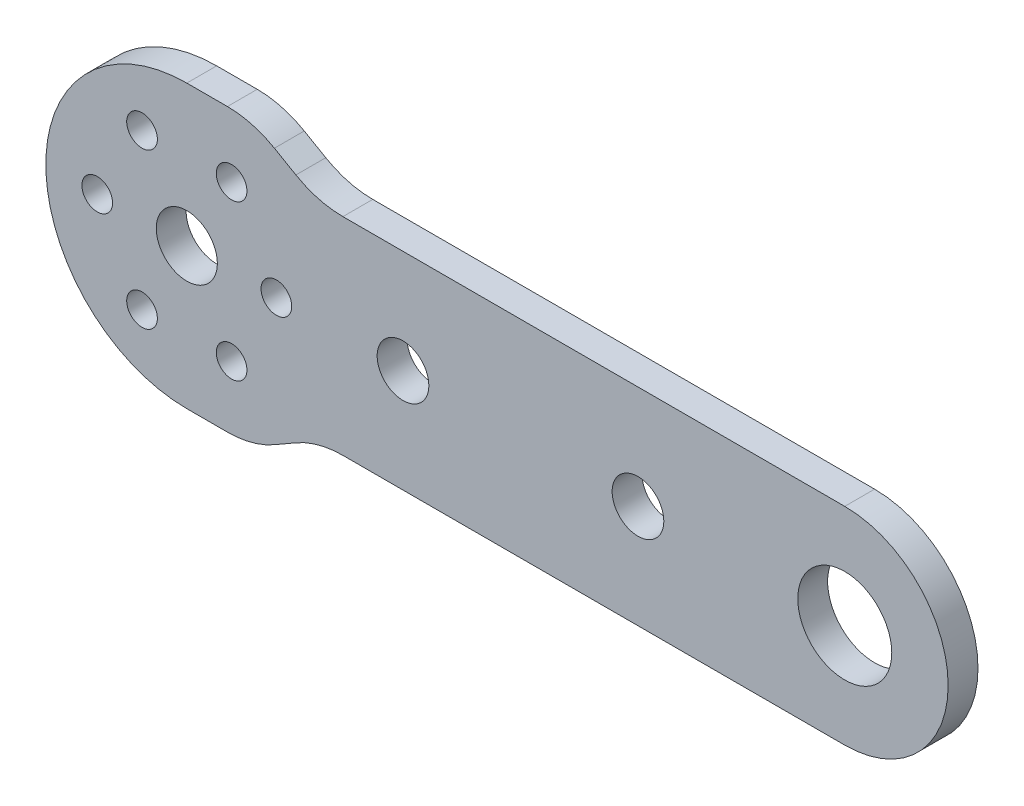
ISO-10303-21;
HEADER;
FILE_DESCRIPTION(('STEP AP214'),'2;1');
FILE_NAME('part.step','',(''),(''),'','','');
FILE_SCHEMA(('AUTOMOTIVE_DESIGN { 1 0 10303 214 1 1 1 1 }'));
ENDSEC;
DATA;
#1=APPLICATION_CONTEXT('core data for automotive mechanical design processes');
#2=APPLICATION_PROTOCOL_DEFINITION('international standard','automotive_design',2000,#1);
#3=PRODUCT_CONTEXT('',#1,'mechanical');
#4=PRODUCT('Part','Part','',(#3));
#5=PRODUCT_RELATED_PRODUCT_CATEGORY('part','',(#4));
#6=PRODUCT_DEFINITION_FORMATION('','',#4);
#7=PRODUCT_DEFINITION_CONTEXT('part definition',#1,'design');
#8=PRODUCT_DEFINITION('design','',#6,#7);
#9=PRODUCT_DEFINITION_SHAPE('','',#8);
#10=(LENGTH_UNIT() NAMED_UNIT(*) SI_UNIT(.MILLI.,.METRE.));
#11=(NAMED_UNIT(*) PLANE_ANGLE_UNIT() SI_UNIT($,.RADIAN.));
#12=(NAMED_UNIT(*) SI_UNIT($,.STERADIAN.) SOLID_ANGLE_UNIT());
#13=UNCERTAINTY_MEASURE_WITH_UNIT(LENGTH_MEASURE(1.E-05),#10,'distance_accuracy_value','');
#14=(GEOMETRIC_REPRESENTATION_CONTEXT(3) GLOBAL_UNCERTAINTY_ASSIGNED_CONTEXT((#13)) GLOBAL_UNIT_ASSIGNED_CONTEXT((#10,
#11,#12)) REPRESENTATION_CONTEXT('',''));
#15=CARTESIAN_POINT('',(0.,0.,0.));
#16=DIRECTION('',(0.,0.,1.));
#17=DIRECTION('',(1.,0.,0.));
#18=AXIS2_PLACEMENT_3D('',#15,#16,#17);
#19=CARTESIAN_POINT('',(0.,0.,89.3789074823255));
#20=DIRECTION('',(0.,0.,1.));
#21=DIRECTION('',(1.,0.,0.));
#22=AXIS2_PLACEMENT_3D('',#19,#20,#21);
#23=PLANE('',#22);
#24=CARTESIAN_POINT('',(23.,0.,89.3789074823255));
#25=DIRECTION('',(0.,0.,1.));
#26=DIRECTION('',(1.,0.,0.));
#27=AXIS2_PLACEMENT_3D('',#24,#25,#26);
#28=CIRCLE('',#27,2.74999999999999);
#29=CARTESIAN_POINT('',(25.75,0.,89.3789074823255));
#30=VERTEX_POINT('',#29);
#31=EDGE_CURVE('E446',#30,#30,#28,.T.);
#32=ORIENTED_EDGE('',*,*,#31,.F.);
#33=EDGE_LOOP('',(#32));
#34=FACE_BOUND('',#33,.T.);
#35=CARTESIAN_POINT('',(48.,0.,89.3789074823255));
#36=DIRECTION('',(0.,0.,1.));
#37=DIRECTION('',(1.,0.,0.));
#38=AXIS2_PLACEMENT_3D('',#35,#36,#37);
#39=CIRCLE('',#38,2.74999999999999);
#40=CARTESIAN_POINT('',(50.75,0.,89.3789074823255));
#41=VERTEX_POINT('',#40);
#42=EDGE_CURVE('E450',#41,#41,#39,.T.);
#43=ORIENTED_EDGE('',*,*,#42,.F.);
#44=EDGE_LOOP('',(#43));
#45=FACE_BOUND('',#44,.T.);
#46=CARTESIAN_POINT('',(9.53000000000001,0.,89.3789074823255));
#47=DIRECTION('',(0.,0.,1.));
#48=DIRECTION('',(1.,0.,0.));
#49=AXIS2_PLACEMENT_3D('',#46,#47,#48);
#50=CIRCLE('',#49,1.63194999999999);
#51=CARTESIAN_POINT('',(11.16195,0.,89.3789074823255));
#52=VERTEX_POINT('',#51);
#53=EDGE_CURVE('E459',#52,#52,#50,.T.);
#54=ORIENTED_EDGE('',*,*,#53,.F.);
#55=EDGE_LOOP('',(#54));
#56=FACE_BOUND('',#55,.T.);
#57=CARTESIAN_POINT('',(4.76500000000001,-8.25322209806569,89.3789074823255));
#58=DIRECTION('',(0.,0.,1.));
#59=DIRECTION('',(1.,0.,0.));
#60=AXIS2_PLACEMENT_3D('',#57,#58,#59);
#61=CIRCLE('',#60,1.63194999999999);
#62=CARTESIAN_POINT('',(6.39695,-8.25322209806569,89.3789074823255));
#63=VERTEX_POINT('',#62);
#64=EDGE_CURVE('E181',#63,#63,#61,.T.);
#65=ORIENTED_EDGE('',*,*,#64,.F.);
#66=EDGE_LOOP('',(#65));
#67=FACE_BOUND('',#66,.T.);
#68=CARTESIAN_POINT('',(-4.76499999999998,-8.2532220980657,89.3789074823255));
#69=DIRECTION('',(0.,0.,1.));
#70=DIRECTION('',(1.,0.,0.));
#71=AXIS2_PLACEMENT_3D('',#68,#69,#70);
#72=CIRCLE('',#71,1.63194999999999);
#73=CARTESIAN_POINT('',(-3.13304999999999,-8.2532220980657,89.3789074823255));
#74=VERTEX_POINT('',#73);
#75=EDGE_CURVE('E178',#74,#74,#72,.T.);
#76=ORIENTED_EDGE('',*,*,#75,.F.);
#77=EDGE_LOOP('',(#76));
#78=FACE_BOUND('',#77,.T.);
#79=CARTESIAN_POINT('',(-9.52999999999998,0.,89.3789074823255));
#80=DIRECTION('',(0.,0.,1.));
#81=DIRECTION('',(1.,0.,0.));
#82=AXIS2_PLACEMENT_3D('',#79,#80,#81);
#83=CIRCLE('',#82,1.63194999999999);
#84=CARTESIAN_POINT('',(-7.89804999999999,0.,89.3789074823255));
#85=VERTEX_POINT('',#84);
#86=EDGE_CURVE('E174',#85,#85,#83,.T.);
#87=ORIENTED_EDGE('',*,*,#86,.F.);
#88=EDGE_LOOP('',(#87));
#89=FACE_BOUND('',#88,.T.);
#90=CARTESIAN_POINT('',(-4.76499999999999,8.2532220980657,89.3789074823255));
#91=DIRECTION('',(0.,0.,1.));
#92=DIRECTION('',(1.,0.,0.));
#93=AXIS2_PLACEMENT_3D('',#90,#91,#92);
#94=CIRCLE('',#93,1.63194999999999);
#95=CARTESIAN_POINT('',(-3.13305,8.2532220980657,89.3789074823255));
#96=VERTEX_POINT('',#95);
#97=EDGE_CURVE('E170',#96,#96,#94,.T.);
#98=ORIENTED_EDGE('',*,*,#97,.F.);
#99=EDGE_LOOP('',(#98));
#100=FACE_BOUND('',#99,.T.);
#101=CARTESIAN_POINT('',(4.76500000000002,8.25322209806569,89.3789074823255));
#102=DIRECTION('',(0.,0.,1.));
#103=DIRECTION('',(1.,0.,0.));
#104=AXIS2_PLACEMENT_3D('',#101,#102,#103);
#105=CIRCLE('',#104,1.63194999999999);
#106=CARTESIAN_POINT('',(6.39695000000001,8.25322209806569,89.3789074823255));
#107=VERTEX_POINT('',#106);
#108=EDGE_CURVE('E169',#107,#107,#105,.T.);
#109=ORIENTED_EDGE('',*,*,#108,.F.);
#110=EDGE_LOOP('',(#109));
#111=FACE_BOUND('',#110,.T.);
#112=CARTESIAN_POINT('',(70.,0.,89.3789074823255));
#113=DIRECTION('',(0.,0.,1.));
#114=DIRECTION('',(1.,0.,0.));
#115=AXIS2_PLACEMENT_3D('',#112,#113,#114);
#116=CIRCLE('',#115,5.00000000000003);
#117=CARTESIAN_POINT('',(75.,0.,89.3789074823255));
#118=VERTEX_POINT('',#117);
#119=EDGE_CURVE('E245',#118,#118,#116,.T.);
#120=ORIENTED_EDGE('',*,*,#119,.F.);
#121=EDGE_LOOP('',(#120));
#122=FACE_BOUND('',#121,.T.);
#123=DIRECTION('',(-0.866025403784438,0.500000000000001,0.));
#124=VECTOR('',#123,1.);
#125=CARTESIAN_POINT('',(13.9282032302755,11.,89.3789074823255));
#126=LINE('',#125,#124);
#127=CARTESIAN_POINT('',(11.6076951545867,12.3397459621556,89.3789074823255));
#128=VERTEX_POINT('',#127);
#129=CARTESIAN_POINT('',(9.3205080756887,13.6602540378444,89.3789074823255));
#130=VERTEX_POINT('',#129);
#131=EDGE_CURVE('E240',#128,#130,#126,.T.);
#132=ORIENTED_EDGE('',*,*,#131,.T.);
#133=CARTESIAN_POINT('',(4.32050807568869,5.00000000000004,89.3789074823255));
#134=DIRECTION('',(0.,0.,1.));
#135=DIRECTION('',(1.,0.,0.));
#136=AXIS2_PLACEMENT_3D('',#133,#134,#135);
#137=CIRCLE('',#136,10.);
#138=CARTESIAN_POINT('',(4.32050807568884,15.,89.3789074823255));
#139=VERTEX_POINT('',#138);
#140=EDGE_CURVE('E193',#130,#139,#137,.T.);
#141=ORIENTED_EDGE('',*,*,#140,.T.);
#142=DIRECTION('',(-1.,0.,0.));
#143=VECTOR('',#142,1.);
#144=CARTESIAN_POINT('',(6.99999999999999,15.,89.3789074823255));
#145=LINE('',#144,#143);
#146=CARTESIAN_POINT('',(0.,15.0000000000001,89.3789074823255));
#147=VERTEX_POINT('',#146);
#148=EDGE_CURVE('E146',#139,#147,#145,.T.);
#149=ORIENTED_EDGE('',*,*,#148,.T.);
#150=CARTESIAN_POINT('',(0.,0.,89.3789074823255));
#151=DIRECTION('',(0.,0.,1.));
#152=DIRECTION('',(1.,0.,0.));
#153=AXIS2_PLACEMENT_3D('',#150,#151,#152);
#154=CIRCLE('',#153,15.0000000000001);
#155=CARTESIAN_POINT('',(0.,-15.,89.3789074823255));
#156=VERTEX_POINT('',#155);
#157=EDGE_CURVE('E140',#147,#156,#154,.T.);
#158=ORIENTED_EDGE('',*,*,#157,.T.);
#159=DIRECTION('',(1.,0.,0.));
#160=VECTOR('',#159,1.);
#161=CARTESIAN_POINT('',(0.,-15.,89.3789074823255));
#162=LINE('',#161,#160);
#163=CARTESIAN_POINT('',(4.32050807568876,-15.,89.3789074823255));
#164=VERTEX_POINT('',#163);
#165=EDGE_CURVE('E129',#156,#164,#162,.T.);
#166=ORIENTED_EDGE('',*,*,#165,.T.);
#167=CARTESIAN_POINT('',(4.32050807568876,-5.,89.3789074823255));
#168=DIRECTION('',(0.,0.,1.));
#169=DIRECTION('',(1.,0.,0.));
#170=AXIS2_PLACEMENT_3D('',#167,#168,#169);
#171=CIRCLE('',#170,10.);
#172=CARTESIAN_POINT('',(9.32050807568877,-13.6602540378444,89.3789074823255));
#173=VERTEX_POINT('',#172);
#174=EDGE_CURVE('E191',#164,#173,#171,.T.);
#175=ORIENTED_EDGE('',*,*,#174,.T.);
#176=DIRECTION('',(0.866025403784438,0.500000000000001,0.));
#177=VECTOR('',#176,1.);
#178=CARTESIAN_POINT('',(6.99999999999999,-15.,89.3789074823255));
#179=LINE('',#178,#177);
#180=CARTESIAN_POINT('',(11.6076951545867,-12.3397459621556,89.3789074823255));
#181=VERTEX_POINT('',#180);
#182=EDGE_CURVE('E139',#173,#181,#179,.T.);
#183=ORIENTED_EDGE('',*,*,#182,.T.);
#184=CARTESIAN_POINT('',(16.6076951545867,-21.,89.3789074823255));
#185=DIRECTION('',(0.,0.,1.));
#186=DIRECTION('',(1.,0.,0.));
#187=AXIS2_PLACEMENT_3D('',#184,#185,#186);
#188=CIRCLE('',#187,10.);
#189=CARTESIAN_POINT('',(16.6076951545867,-11.,89.3789074823255));
#190=VERTEX_POINT('',#189);
#191=EDGE_CURVE('E11',#181,#190,#188,.F.);
#192=ORIENTED_EDGE('',*,*,#191,.T.);
#193=DIRECTION('',(1.,0.,0.));
#194=VECTOR('',#193,1.);
#195=CARTESIAN_POINT('',(13.9282032302755,-11.,89.3789074823255));
#196=LINE('',#195,#194);
#197=CARTESIAN_POINT('',(70.,-11.,89.3789074823255));
#198=VERTEX_POINT('',#197);
#199=EDGE_CURVE('E231',#190,#198,#196,.T.);
#200=ORIENTED_EDGE('',*,*,#199,.T.);
#201=CARTESIAN_POINT('',(70.,0.,89.3789074823255));
#202=DIRECTION('',(0.,0.,1.));
#203=DIRECTION('',(-1.,0.,0.));
#204=AXIS2_PLACEMENT_3D('',#201,#202,#203);
#205=CIRCLE('',#204,11.);
#206=CARTESIAN_POINT('',(70.,11.,89.3789074823255));
#207=VERTEX_POINT('',#206);
#208=EDGE_CURVE('E233',#198,#207,#205,.T.);
#209=ORIENTED_EDGE('',*,*,#208,.T.);
#210=DIRECTION('',(-1.,0.,0.));
#211=VECTOR('',#210,1.);
#212=CARTESIAN_POINT('',(13.9282032302755,11.,89.3789074823255));
#213=LINE('',#212,#211);
#214=CARTESIAN_POINT('',(16.6076951545867,11.,89.3789074823255));
#215=VERTEX_POINT('',#214);
#216=EDGE_CURVE('E235',#207,#215,#213,.T.);
#217=ORIENTED_EDGE('',*,*,#216,.T.);
#218=CARTESIAN_POINT('',(16.6076951545867,21.,89.3789074823255));
#219=DIRECTION('',(0.,0.,1.));
#220=DIRECTION('',(1.,0.,0.));
#221=AXIS2_PLACEMENT_3D('',#218,#219,#220);
#222=CIRCLE('',#221,10.);
#223=EDGE_CURVE('E207',#215,#128,#222,.F.);
#224=ORIENTED_EDGE('',*,*,#223,.T.);
#225=EDGE_LOOP('',(#132,#141,#149,#158,#166,#175,#183,#192,#200,#209,#217,#224));
#226=FACE_BOUND('',#225,.T.);
#227=CARTESIAN_POINT('',(0.,0.,89.3789074823255));
#228=DIRECTION('',(0.,0.,1.));
#229=DIRECTION('',(1.,0.,0.));
#230=AXIS2_PLACEMENT_3D('',#227,#228,#229);
#231=CIRCLE('',#230,3.25);
#232=CARTESIAN_POINT('',(3.24999999999999,0.,89.3789074823255));
#233=VERTEX_POINT('',#232);
#234=EDGE_CURVE('E479',#233,#233,#231,.T.);
#235=ORIENTED_EDGE('',*,*,#234,.F.);
#236=EDGE_LOOP('',(#235));
#237=FACE_BOUND('',#236,.T.);
#238=ADVANCED_FACE('F39',(#34,#45,#56,#67,#78,#89,#100,#111,#122,#226,#237),#23,.T.);
#239=CARTESIAN_POINT('',(0.,0.,86.2039074823255));
#240=DIRECTION('',(0.,0.,1.));
#241=DIRECTION('',(1.,0.,0.));
#242=AXIS2_PLACEMENT_3D('',#239,#240,#241);
#243=PLANE('',#242);
#244=CARTESIAN_POINT('',(23.,0.,86.2039074823255));
#245=DIRECTION('',(0.,0.,1.));
#246=DIRECTION('',(1.,0.,0.));
#247=AXIS2_PLACEMENT_3D('',#244,#245,#246);
#248=CIRCLE('',#247,2.74999999999999);
#249=CARTESIAN_POINT('',(25.75,0.,86.2039074823255));
#250=VERTEX_POINT('',#249);
#251=EDGE_CURVE('E449',#250,#250,#248,.T.);
#252=ORIENTED_EDGE('',*,*,#251,.T.);
#253=EDGE_LOOP('',(#252));
#254=FACE_BOUND('',#253,.T.);
#255=CARTESIAN_POINT('',(48.,0.,86.2039074823255));
#256=DIRECTION('',(0.,0.,1.));
#257=DIRECTION('',(1.,0.,0.));
#258=AXIS2_PLACEMENT_3D('',#255,#256,#257);
#259=CIRCLE('',#258,2.74999999999999);
#260=CARTESIAN_POINT('',(50.75,0.,86.2039074823255));
#261=VERTEX_POINT('',#260);
#262=EDGE_CURVE('E453',#261,#261,#259,.T.);
#263=ORIENTED_EDGE('',*,*,#262,.T.);
#264=EDGE_LOOP('',(#263));
#265=FACE_BOUND('',#264,.T.);
#266=CARTESIAN_POINT('',(9.53000000000001,0.,86.2039074823255));
#267=DIRECTION('',(0.,0.,1.));
#268=DIRECTION('',(1.,0.,0.));
#269=AXIS2_PLACEMENT_3D('',#266,#267,#268);
#270=CIRCLE('',#269,1.63194999999999);
#271=CARTESIAN_POINT('',(11.16195,0.,86.2039074823255));
#272=VERTEX_POINT('',#271);
#273=EDGE_CURVE('E462',#272,#272,#270,.T.);
#274=ORIENTED_EDGE('',*,*,#273,.T.);
#275=EDGE_LOOP('',(#274));
#276=FACE_BOUND('',#275,.T.);
#277=CARTESIAN_POINT('',(4.76500000000001,-8.25322209806569,86.2039074823255));
#278=DIRECTION('',(0.,0.,1.));
#279=DIRECTION('',(1.,0.,0.));
#280=AXIS2_PLACEMENT_3D('',#277,#278,#279);
#281=CIRCLE('',#280,1.63194999999999);
#282=CARTESIAN_POINT('',(6.39694999999999,-8.25322209806569,86.2039074823255));
#283=VERTEX_POINT('',#282);
#284=EDGE_CURVE('E179',#283,#283,#281,.T.);
#285=ORIENTED_EDGE('',*,*,#284,.T.);
#286=EDGE_LOOP('',(#285));
#287=FACE_BOUND('',#286,.T.);
#288=CARTESIAN_POINT('',(-4.76499999999998,-8.2532220980657,86.2039074823255));
#289=DIRECTION('',(0.,0.,1.));
#290=DIRECTION('',(1.,0.,0.));
#291=AXIS2_PLACEMENT_3D('',#288,#289,#290);
#292=CIRCLE('',#291,1.63194999999999);
#293=CARTESIAN_POINT('',(-3.13304999999999,-8.2532220980657,86.2039074823255));
#294=VERTEX_POINT('',#293);
#295=EDGE_CURVE('E175',#294,#294,#292,.T.);
#296=ORIENTED_EDGE('',*,*,#295,.T.);
#297=EDGE_LOOP('',(#296));
#298=FACE_BOUND('',#297,.T.);
#299=CARTESIAN_POINT('',(-9.52999999999998,0.,86.2039074823255));
#300=DIRECTION('',(0.,0.,1.));
#301=DIRECTION('',(1.,0.,0.));
#302=AXIS2_PLACEMENT_3D('',#299,#300,#301);
#303=CIRCLE('',#302,1.63194999999999);
#304=CARTESIAN_POINT('',(-7.89804999999999,0.,86.2039074823255));
#305=VERTEX_POINT('',#304);
#306=EDGE_CURVE('E171',#305,#305,#303,.T.);
#307=ORIENTED_EDGE('',*,*,#306,.T.);
#308=EDGE_LOOP('',(#307));
#309=FACE_BOUND('',#308,.T.);
#310=CARTESIAN_POINT('',(-4.76499999999999,8.2532220980657,86.2039074823255));
#311=DIRECTION('',(0.,0.,1.));
#312=DIRECTION('',(1.,0.,0.));
#313=AXIS2_PLACEMENT_3D('',#310,#311,#312);
#314=CIRCLE('',#313,1.63194999999999);
#315=CARTESIAN_POINT('',(-3.13305,8.2532220980657,86.2039074823255));
#316=VERTEX_POINT('',#315);
#317=EDGE_CURVE('E166',#316,#316,#314,.T.);
#318=ORIENTED_EDGE('',*,*,#317,.T.);
#319=EDGE_LOOP('',(#318));
#320=FACE_BOUND('',#319,.T.);
#321=CARTESIAN_POINT('',(4.76500000000002,8.25322209806569,86.2039074823255));
#322=DIRECTION('',(0.,0.,1.));
#323=DIRECTION('',(1.,0.,0.));
#324=AXIS2_PLACEMENT_3D('',#321,#322,#323);
#325=CIRCLE('',#324,1.63194999999999);
#326=CARTESIAN_POINT('',(6.39695000000001,8.25322209806569,86.2039074823255));
#327=VERTEX_POINT('',#326);
#328=EDGE_CURVE('E475',#327,#327,#325,.T.);
#329=ORIENTED_EDGE('',*,*,#328,.T.);
#330=EDGE_LOOP('',(#329));
#331=FACE_BOUND('',#330,.T.);
#332=CARTESIAN_POINT('',(70.,0.,86.2039074823255));
#333=DIRECTION('',(0.,0.,1.));
#334=DIRECTION('',(1.,0.,0.));
#335=AXIS2_PLACEMENT_3D('',#332,#333,#334);
#336=CIRCLE('',#335,5.00000000000003);
#337=CARTESIAN_POINT('',(75.,0.,86.2039074823255));
#338=VERTEX_POINT('',#337);
#339=EDGE_CURVE('E482',#338,#338,#336,.T.);
#340=ORIENTED_EDGE('',*,*,#339,.T.);
#341=EDGE_LOOP('',(#340));
#342=FACE_BOUND('',#341,.T.);
#343=DIRECTION('',(-1.,0.,0.));
#344=VECTOR('',#343,1.);
#345=CARTESIAN_POINT('',(6.99999999999999,15.,86.2039074823255));
#346=LINE('',#345,#344);
#347=CARTESIAN_POINT('',(4.32050807568884,15.,86.2039074823255));
#348=VERTEX_POINT('',#347);
#349=CARTESIAN_POINT('',(0.,15.0000000000001,86.2039074823255));
#350=VERTEX_POINT('',#349);
#351=EDGE_CURVE('E150',#348,#350,#346,.T.);
#352=ORIENTED_EDGE('',*,*,#351,.F.);
#353=CARTESIAN_POINT('',(4.32050807568869,5.00000000000004,86.2039074823255));
#354=DIRECTION('',(0.,0.,1.));
#355=DIRECTION('',(1.,0.,0.));
#356=AXIS2_PLACEMENT_3D('',#353,#354,#355);
#357=CIRCLE('',#356,10.);
#358=CARTESIAN_POINT('',(9.3205080756887,13.6602540378444,86.2039074823255));
#359=VERTEX_POINT('',#358);
#360=EDGE_CURVE('E184',#348,#359,#357,.F.);
#361=ORIENTED_EDGE('',*,*,#360,.T.);
#362=DIRECTION('',(-0.866025403784438,0.500000000000001,0.));
#363=VECTOR('',#362,1.);
#364=CARTESIAN_POINT('',(13.9282032302755,11.,86.2039074823255));
#365=LINE('',#364,#363);
#366=CARTESIAN_POINT('',(11.6076951545867,12.3397459621556,86.2039074823255));
#367=VERTEX_POINT('',#366);
#368=EDGE_CURVE('E252',#367,#359,#365,.T.);
#369=ORIENTED_EDGE('',*,*,#368,.F.);
#370=CARTESIAN_POINT('',(16.6076951545867,21.,86.2039074823255));
#371=DIRECTION('',(0.,0.,1.));
#372=DIRECTION('',(1.,0.,0.));
#373=AXIS2_PLACEMENT_3D('',#370,#371,#372);
#374=CIRCLE('',#373,10.);
#375=CARTESIAN_POINT('',(16.6076951545867,11.,86.2039074823255));
#376=VERTEX_POINT('',#375);
#377=EDGE_CURVE('E205',#367,#376,#374,.T.);
#378=ORIENTED_EDGE('',*,*,#377,.T.);
#379=DIRECTION('',(-1.,0.,0.));
#380=VECTOR('',#379,1.);
#381=CARTESIAN_POINT('',(13.9282032302755,11.,86.2039074823255));
#382=LINE('',#381,#380);
#383=CARTESIAN_POINT('',(70.,11.,86.2039074823255));
#384=VERTEX_POINT('',#383);
#385=EDGE_CURVE('E250',#384,#376,#382,.T.);
#386=ORIENTED_EDGE('',*,*,#385,.F.);
#387=CARTESIAN_POINT('',(70.,0.,86.2039074823255));
#388=DIRECTION('',(0.,0.,1.));
#389=DIRECTION('',(-1.,0.,0.));
#390=AXIS2_PLACEMENT_3D('',#387,#388,#389);
#391=CIRCLE('',#390,11.);
#392=CARTESIAN_POINT('',(70.,-11.,86.2039074823255));
#393=VERTEX_POINT('',#392);
#394=EDGE_CURVE('E248',#393,#384,#391,.T.);
#395=ORIENTED_EDGE('',*,*,#394,.F.);
#396=DIRECTION('',(1.,0.,0.));
#397=VECTOR('',#396,1.);
#398=CARTESIAN_POINT('',(13.9282032302755,-11.,86.2039074823255));
#399=LINE('',#398,#397);
#400=CARTESIAN_POINT('',(16.6076951545867,-11.,86.2039074823255));
#401=VERTEX_POINT('',#400);
#402=EDGE_CURVE('E217',#401,#393,#399,.T.);
#403=ORIENTED_EDGE('',*,*,#402,.F.);
#404=CARTESIAN_POINT('',(16.6076951545867,-21.,86.2039074823255));
#405=DIRECTION('',(0.,0.,1.));
#406=DIRECTION('',(1.,0.,0.));
#407=AXIS2_PLACEMENT_3D('',#404,#405,#406);
#408=CIRCLE('',#407,10.);
#409=CARTESIAN_POINT('',(11.6076951545867,-12.3397459621556,86.2039074823255));
#410=VERTEX_POINT('',#409);
#411=EDGE_CURVE('E47',#401,#410,#408,.T.);
#412=ORIENTED_EDGE('',*,*,#411,.T.);
#413=DIRECTION('',(0.866025403784438,0.500000000000001,0.));
#414=VECTOR('',#413,1.);
#415=CARTESIAN_POINT('',(6.99999999999999,-15.,86.2039074823255));
#416=LINE('',#415,#414);
#417=CARTESIAN_POINT('',(9.32050807568877,-13.6602540378444,86.2039074823255));
#418=VERTEX_POINT('',#417);
#419=EDGE_CURVE('E215',#418,#410,#416,.T.);
#420=ORIENTED_EDGE('',*,*,#419,.F.);
#421=CARTESIAN_POINT('',(4.32050807568876,-5.,86.2039074823255));
#422=DIRECTION('',(0.,0.,1.));
#423=DIRECTION('',(1.,0.,0.));
#424=AXIS2_PLACEMENT_3D('',#421,#422,#423);
#425=CIRCLE('',#424,10.);
#426=CARTESIAN_POINT('',(4.32050807568876,-15.,86.2039074823255));
#427=VERTEX_POINT('',#426);
#428=EDGE_CURVE('E159',#418,#427,#425,.F.);
#429=ORIENTED_EDGE('',*,*,#428,.T.);
#430=DIRECTION('',(1.,0.,0.));
#431=VECTOR('',#430,1.);
#432=CARTESIAN_POINT('',(0.,-15.,86.2039074823255));
#433=LINE('',#432,#431);
#434=CARTESIAN_POINT('',(0.,-15.,86.2039074823255));
#435=VERTEX_POINT('',#434);
#436=EDGE_CURVE('E225',#435,#427,#433,.T.);
#437=ORIENTED_EDGE('',*,*,#436,.F.);
#438=CARTESIAN_POINT('',(0.,0.,86.2039074823255));
#439=DIRECTION('',(0.,0.,1.));
#440=DIRECTION('',(1.,0.,0.));
#441=AXIS2_PLACEMENT_3D('',#438,#439,#440);
#442=CIRCLE('',#441,15.0000000000001);
#443=EDGE_CURVE('E154',#350,#435,#442,.T.);
#444=ORIENTED_EDGE('',*,*,#443,.F.);
#445=EDGE_LOOP('',(#352,#361,#369,#378,#386,#395,#403,#412,#420,#429,#437,#444));
#446=FACE_BOUND('',#445,.T.);
#447=CARTESIAN_POINT('',(0.,0.,86.2039074823255));
#448=DIRECTION('',(0.,0.,1.));
#449=DIRECTION('',(1.,0.,0.));
#450=AXIS2_PLACEMENT_3D('',#447,#448,#449);
#451=CIRCLE('',#450,3.25);
#452=CARTESIAN_POINT('',(3.24999999999999,0.,86.2039074823255));
#453=VERTEX_POINT('',#452);
#454=EDGE_CURVE('E478',#453,#453,#451,.T.);
#455=ORIENTED_EDGE('',*,*,#454,.T.);
#456=EDGE_LOOP('',(#455));
#457=FACE_BOUND('',#456,.T.);
#458=ADVANCED_FACE('F213',(#254,#265,#276,#287,#298,#309,#320,#331,#342,#446,#457),#243,.F.);
#459=CARTESIAN_POINT('',(0.,0.,89.3789074823255));
#460=DIRECTION('',(0.,0.,-1.));
#461=DIRECTION('',(-1.,0.,0.));
#462=AXIS2_PLACEMENT_3D('',#459,#460,#461);
#463=CYLINDRICAL_SURFACE('',#462,15.0000000000001);
#464=ORIENTED_EDGE('',*,*,#443,.T.);
#465=DIRECTION('',(0.,0.,-1.));
#466=VECTOR('',#465,1.);
#467=CARTESIAN_POINT('',(0.,-15.,89.3789074823255));
#468=LINE('',#467,#466);
#469=EDGE_CURVE('E134',#156,#435,#468,.T.);
#470=ORIENTED_EDGE('',*,*,#469,.F.);
#471=ORIENTED_EDGE('',*,*,#157,.F.);
#472=DIRECTION('',(0.,0.,-1.));
#473=VECTOR('',#472,1.);
#474=CARTESIAN_POINT('',(0.,15.0000000000001,89.3789074823255));
#475=LINE('',#474,#473);
#476=EDGE_CURVE('E243',#147,#350,#475,.T.);
#477=ORIENTED_EDGE('',*,*,#476,.T.);
#478=EDGE_LOOP('',(#464,#470,#471,#477));
#479=FACE_BOUND('',#478,.T.);
#480=ADVANCED_FACE('F152',(#479),#463,.T.);
#481=CARTESIAN_POINT('',(0.,-15.,89.3789074823255));
#482=DIRECTION('',(0.,1.,0.));
#483=DIRECTION('',(0.,0.,1.));
#484=AXIS2_PLACEMENT_3D('',#481,#482,#483);
#485=PLANE('',#484);
#486=ORIENTED_EDGE('',*,*,#436,.T.);
#487=DIRECTION('',(0.,0.,-1.));
#488=VECTOR('',#487,1.);
#489=CARTESIAN_POINT('',(4.32050807568876,-15.,89.3789074823255));
#490=LINE('',#489,#488);
#491=EDGE_CURVE('E137',#427,#164,#490,.F.);
#492=ORIENTED_EDGE('',*,*,#491,.T.);
#493=ORIENTED_EDGE('',*,*,#165,.F.);
#494=ORIENTED_EDGE('',*,*,#469,.T.);
#495=EDGE_LOOP('',(#486,#492,#493,#494));
#496=FACE_BOUND('',#495,.T.);
#497=ADVANCED_FACE('F132',(#496),#485,.F.);
#498=CARTESIAN_POINT('',(6.99999999999999,-15.,89.3789074823255));
#499=DIRECTION('',(-0.500000000000001,0.866025403784438,0.));
#500=DIRECTION('',(-0.866025403784438,-0.500000000000001,0.));
#501=AXIS2_PLACEMENT_3D('',#498,#499,#500);
#502=PLANE('',#501);
#503=ORIENTED_EDGE('',*,*,#419,.T.);
#504=DIRECTION('',(0.,0.,-1.));
#505=VECTOR('',#504,1.);
#506=CARTESIAN_POINT('',(11.6076951545867,-12.3397459621556,89.3789074823255));
#507=LINE('',#506,#505);
#508=EDGE_CURVE('E202',#410,#181,#507,.F.);
#509=ORIENTED_EDGE('',*,*,#508,.T.);
#510=ORIENTED_EDGE('',*,*,#182,.F.);
#511=DIRECTION('',(0.,0.,-1.));
#512=VECTOR('',#511,1.);
#513=CARTESIAN_POINT('',(9.32050807568877,-13.6602540378444,89.3789074823255));
#514=LINE('',#513,#512);
#515=EDGE_CURVE('E199',#173,#418,#514,.T.);
#516=ORIENTED_EDGE('',*,*,#515,.T.);
#517=EDGE_LOOP('',(#503,#509,#510,#516));
#518=FACE_BOUND('',#517,.T.);
#519=ADVANCED_FACE('F222',(#518),#502,.F.);
#520=CARTESIAN_POINT('',(13.9282032302755,-11.,89.3789074823255));
#521=DIRECTION('',(0.,1.,0.));
#522=DIRECTION('',(0.,0.,1.));
#523=AXIS2_PLACEMENT_3D('',#520,#521,#522);
#524=PLANE('',#523);
#525=ORIENTED_EDGE('',*,*,#199,.F.);
#526=DIRECTION('',(0.,0.,-1.));
#527=VECTOR('',#526,1.);
#528=CARTESIAN_POINT('',(16.6076951545867,-11.,86.2039074823255));
#529=LINE('',#528,#527);
#530=EDGE_CURVE('E196',#190,#401,#529,.T.);
#531=ORIENTED_EDGE('',*,*,#530,.T.);
#532=ORIENTED_EDGE('',*,*,#402,.T.);
#533=DIRECTION('',(0.,0.,-1.));
#534=VECTOR('',#533,1.);
#535=CARTESIAN_POINT('',(70.,-11.,89.3789074823255));
#536=LINE('',#535,#534);
#537=EDGE_CURVE('E156',#198,#393,#536,.T.);
#538=ORIENTED_EDGE('',*,*,#537,.F.);
#539=EDGE_LOOP('',(#525,#531,#532,#538));
#540=FACE_BOUND('',#539,.T.);
#541=ADVANCED_FACE('F229',(#540),#524,.F.);
#542=CARTESIAN_POINT('',(70.,0.,89.3789074823255));
#543=DIRECTION('',(0.,0.,-1.));
#544=DIRECTION('',(-1.,0.,0.));
#545=AXIS2_PLACEMENT_3D('',#542,#543,#544);
#546=CYLINDRICAL_SURFACE('',#545,11.);
#547=ORIENTED_EDGE('',*,*,#394,.T.);
#548=DIRECTION('',(0.,0.,-1.));
#549=VECTOR('',#548,1.);
#550=CARTESIAN_POINT('',(70.,11.,89.3789074823255));
#551=LINE('',#550,#549);
#552=EDGE_CURVE('E162',#207,#384,#551,.T.);
#553=ORIENTED_EDGE('',*,*,#552,.F.);
#554=ORIENTED_EDGE('',*,*,#208,.F.);
#555=ORIENTED_EDGE('',*,*,#537,.T.);
#556=EDGE_LOOP('',(#547,#553,#554,#555));
#557=FACE_BOUND('',#556,.T.);
#558=ADVANCED_FACE('F302',(#557),#546,.T.);
#559=CARTESIAN_POINT('',(13.9282032302755,11.,89.3789074823255));
#560=DIRECTION('',(0.,-1.,0.));
#561=DIRECTION('',(1.,0.,0.));
#562=AXIS2_PLACEMENT_3D('',#559,#560,#561);
#563=PLANE('',#562);
#564=ORIENTED_EDGE('',*,*,#385,.T.);
#565=DIRECTION('',(0.,0.,-1.));
#566=VECTOR('',#565,1.);
#567=CARTESIAN_POINT('',(16.6076951545867,11.,89.3789074823255));
#568=LINE('',#567,#566);
#569=EDGE_CURVE('E54',#376,#215,#568,.F.);
#570=ORIENTED_EDGE('',*,*,#569,.T.);
#571=ORIENTED_EDGE('',*,*,#216,.F.);
#572=ORIENTED_EDGE('',*,*,#552,.T.);
#573=EDGE_LOOP('',(#564,#570,#571,#572));
#574=FACE_BOUND('',#573,.T.);
#575=ADVANCED_FACE('F259',(#574),#563,.F.);
#576=CARTESIAN_POINT('',(13.9282032302755,11.,89.3789074823255));
#577=DIRECTION('',(-0.500000000000001,-0.866025403784438,0.));
#578=DIRECTION('',(0.866025403784438,-0.500000000000001,0.));
#579=AXIS2_PLACEMENT_3D('',#576,#577,#578);
#580=PLANE('',#579);
#581=ORIENTED_EDGE('',*,*,#368,.T.);
#582=DIRECTION('',(0.,0.,-1.));
#583=VECTOR('',#582,1.);
#584=CARTESIAN_POINT('',(9.3205080756887,13.6602540378444,89.3789074823255));
#585=LINE('',#584,#583);
#586=EDGE_CURVE('E189',#359,#130,#585,.F.);
#587=ORIENTED_EDGE('',*,*,#586,.T.);
#588=ORIENTED_EDGE('',*,*,#131,.F.);
#589=DIRECTION('',(0.,0.,-1.));
#590=VECTOR('',#589,1.);
#591=CARTESIAN_POINT('',(11.6076951545867,12.3397459621556,86.2039074823255));
#592=LINE('',#591,#590);
#593=EDGE_CURVE('E186',#128,#367,#592,.T.);
#594=ORIENTED_EDGE('',*,*,#593,.T.);
#595=EDGE_LOOP('',(#581,#587,#588,#594));
#596=FACE_BOUND('',#595,.T.);
#597=ADVANCED_FACE('F268',(#596),#580,.F.);
#598=CARTESIAN_POINT('',(6.99999999999999,15.,89.3789074823255));
#599=DIRECTION('',(0.,-1.,0.));
#600=DIRECTION('',(1.,0.,0.));
#601=AXIS2_PLACEMENT_3D('',#598,#599,#600);
#602=PLANE('',#601);
#603=ORIENTED_EDGE('',*,*,#148,.F.);
#604=DIRECTION('',(0.,0.,-1.));
#605=VECTOR('',#604,1.);
#606=CARTESIAN_POINT('',(4.32050807568884,15.,89.3789074823255));
#607=LINE('',#606,#605);
#608=EDGE_CURVE('E155',#139,#348,#607,.T.);
#609=ORIENTED_EDGE('',*,*,#608,.T.);
#610=ORIENTED_EDGE('',*,*,#351,.T.);
#611=ORIENTED_EDGE('',*,*,#476,.F.);
#612=EDGE_LOOP('',(#603,#609,#610,#611));
#613=FACE_BOUND('',#612,.T.);
#614=ADVANCED_FACE('F275',(#613),#602,.F.);
#615=CARTESIAN_POINT('',(70.,0.,89.3789074823255));
#616=DIRECTION('',(0.,0.,-1.));
#617=DIRECTION('',(-1.,0.,0.));
#618=AXIS2_PLACEMENT_3D('',#615,#616,#617);
#619=CYLINDRICAL_SURFACE('',#618,5.00000000000003);
#620=ORIENTED_EDGE('',*,*,#119,.T.);
#621=EDGE_LOOP('',(#620));
#622=FACE_BOUND('',#621,.T.);
#623=ORIENTED_EDGE('',*,*,#339,.F.);
#624=EDGE_LOOP('',(#623));
#625=FACE_BOUND('',#624,.T.);
#626=ADVANCED_FACE('F293',(#622,#625),#619,.F.);
#627=CARTESIAN_POINT('',(0.,0.,89.3789074823255));
#628=DIRECTION('',(0.,0.,-1.));
#629=DIRECTION('',(-1.,0.,0.));
#630=AXIS2_PLACEMENT_3D('',#627,#628,#629);
#631=CYLINDRICAL_SURFACE('',#630,3.25);
#632=ORIENTED_EDGE('',*,*,#234,.T.);
#633=EDGE_LOOP('',(#632));
#634=FACE_BOUND('',#633,.T.);
#635=ORIENTED_EDGE('',*,*,#454,.F.);
#636=EDGE_LOOP('',(#635));
#637=FACE_BOUND('',#636,.T.);
#638=ADVANCED_FACE('F374',(#634,#637),#631,.F.);
#639=CARTESIAN_POINT('',(4.76500000000002,8.25322209806569,89.3789074823255));
#640=DIRECTION('',(0.,0.,1.));
#641=DIRECTION('',(1.,0.,0.));
#642=AXIS2_PLACEMENT_3D('',#639,#640,#641);
#643=CYLINDRICAL_SURFACE('',#642,1.63194999999999);
#644=ORIENTED_EDGE('',*,*,#108,.T.);
#645=EDGE_LOOP('',(#644));
#646=FACE_BOUND('',#645,.T.);
#647=ORIENTED_EDGE('',*,*,#328,.F.);
#648=EDGE_LOOP('',(#647));
#649=FACE_BOUND('',#648,.T.);
#650=ADVANCED_FACE('F381',(#646,#649),#643,.F.);
#651=CARTESIAN_POINT('',(-4.76499999999999,8.2532220980657,89.3789074823255));
#652=DIRECTION('',(0.,0.,1.));
#653=DIRECTION('',(1.,0.,0.));
#654=AXIS2_PLACEMENT_3D('',#651,#652,#653);
#655=CYLINDRICAL_SURFACE('',#654,1.63194999999999);
#656=ORIENTED_EDGE('',*,*,#97,.T.);
#657=EDGE_LOOP('',(#656));
#658=FACE_BOUND('',#657,.T.);
#659=ORIENTED_EDGE('',*,*,#317,.F.);
#660=EDGE_LOOP('',(#659));
#661=FACE_BOUND('',#660,.T.);
#662=ADVANCED_FACE('F388',(#658,#661),#655,.F.);
#663=CARTESIAN_POINT('',(-9.52999999999998,0.,89.3789074823255));
#664=DIRECTION('',(0.,0.,1.));
#665=DIRECTION('',(1.,0.,0.));
#666=AXIS2_PLACEMENT_3D('',#663,#664,#665);
#667=CYLINDRICAL_SURFACE('',#666,1.63194999999999);
#668=ORIENTED_EDGE('',*,*,#86,.T.);
#669=EDGE_LOOP('',(#668));
#670=FACE_BOUND('',#669,.T.);
#671=ORIENTED_EDGE('',*,*,#306,.F.);
#672=EDGE_LOOP('',(#671));
#673=FACE_BOUND('',#672,.T.);
#674=ADVANCED_FACE('F396',(#670,#673),#667,.F.);
#675=CARTESIAN_POINT('',(-4.76499999999998,-8.2532220980657,89.3789074823255));
#676=DIRECTION('',(0.,0.,1.));
#677=DIRECTION('',(1.,0.,0.));
#678=AXIS2_PLACEMENT_3D('',#675,#676,#677);
#679=CYLINDRICAL_SURFACE('',#678,1.63194999999999);
#680=ORIENTED_EDGE('',*,*,#75,.T.);
#681=EDGE_LOOP('',(#680));
#682=FACE_BOUND('',#681,.T.);
#683=ORIENTED_EDGE('',*,*,#295,.F.);
#684=EDGE_LOOP('',(#683));
#685=FACE_BOUND('',#684,.T.);
#686=ADVANCED_FACE('F404',(#682,#685),#679,.F.);
#687=CARTESIAN_POINT('',(4.76500000000001,-8.25322209806569,89.3789074823255));
#688=DIRECTION('',(0.,0.,1.));
#689=DIRECTION('',(1.,0.,0.));
#690=AXIS2_PLACEMENT_3D('',#687,#688,#689);
#691=CYLINDRICAL_SURFACE('',#690,1.63194999999999);
#692=ORIENTED_EDGE('',*,*,#64,.T.);
#693=EDGE_LOOP('',(#692));
#694=FACE_BOUND('',#693,.T.);
#695=ORIENTED_EDGE('',*,*,#284,.F.);
#696=EDGE_LOOP('',(#695));
#697=FACE_BOUND('',#696,.T.);
#698=ADVANCED_FACE('F412',(#694,#697),#691,.F.);
#699=CARTESIAN_POINT('',(9.53000000000001,0.,89.3789074823255));
#700=DIRECTION('',(0.,0.,1.));
#701=DIRECTION('',(1.,0.,0.));
#702=AXIS2_PLACEMENT_3D('',#699,#700,#701);
#703=CYLINDRICAL_SURFACE('',#702,1.63194999999999);
#704=ORIENTED_EDGE('',*,*,#53,.T.);
#705=EDGE_LOOP('',(#704));
#706=FACE_BOUND('',#705,.T.);
#707=ORIENTED_EDGE('',*,*,#273,.F.);
#708=EDGE_LOOP('',(#707));
#709=FACE_BOUND('',#708,.T.);
#710=ADVANCED_FACE('F420',(#706,#709),#703,.F.);
#711=CARTESIAN_POINT('',(48.,0.,89.3789074823255));
#712=DIRECTION('',(0.,0.,1.));
#713=DIRECTION('',(1.,0.,0.));
#714=AXIS2_PLACEMENT_3D('',#711,#712,#713);
#715=CYLINDRICAL_SURFACE('',#714,2.74999999999999);
#716=ORIENTED_EDGE('',*,*,#42,.T.);
#717=EDGE_LOOP('',(#716));
#718=FACE_BOUND('',#717,.T.);
#719=ORIENTED_EDGE('',*,*,#262,.F.);
#720=EDGE_LOOP('',(#719));
#721=FACE_BOUND('',#720,.T.);
#722=ADVANCED_FACE('F428',(#718,#721),#715,.F.);
#723=CARTESIAN_POINT('',(23.,0.,89.3789074823255));
#724=DIRECTION('',(0.,0.,1.));
#725=DIRECTION('',(1.,0.,0.));
#726=AXIS2_PLACEMENT_3D('',#723,#724,#725);
#727=CYLINDRICAL_SURFACE('',#726,2.74999999999999);
#728=ORIENTED_EDGE('',*,*,#31,.T.);
#729=EDGE_LOOP('',(#728));
#730=FACE_BOUND('',#729,.T.);
#731=ORIENTED_EDGE('',*,*,#251,.F.);
#732=EDGE_LOOP('',(#731));
#733=FACE_BOUND('',#732,.T.);
#734=ADVANCED_FACE('F315',(#730,#733),#727,.F.);
#735=CARTESIAN_POINT('',(4.32050807568869,5.00000000000004,89.3789074823255));
#736=DIRECTION('',(0.,0.,-1.));
#737=DIRECTION('',(-1.,0.,0.));
#738=AXIS2_PLACEMENT_3D('',#735,#736,#737);
#739=CYLINDRICAL_SURFACE('',#738,10.);
#740=ORIENTED_EDGE('',*,*,#140,.F.);
#741=ORIENTED_EDGE('',*,*,#586,.F.);
#742=ORIENTED_EDGE('',*,*,#360,.F.);
#743=ORIENTED_EDGE('',*,*,#608,.F.);
#744=EDGE_LOOP('',(#740,#741,#742,#743));
#745=FACE_BOUND('',#744,.T.);
#746=ADVANCED_FACE('F273',(#745),#739,.T.);
#747=CARTESIAN_POINT('',(16.6076951545867,21.,89.3789074823255));
#748=DIRECTION('',(0.,0.,1.));
#749=DIRECTION('',(1.,0.,0.));
#750=AXIS2_PLACEMENT_3D('',#747,#748,#749);
#751=CYLINDRICAL_SURFACE('',#750,10.);
#752=ORIENTED_EDGE('',*,*,#223,.F.);
#753=ORIENTED_EDGE('',*,*,#569,.F.);
#754=ORIENTED_EDGE('',*,*,#377,.F.);
#755=ORIENTED_EDGE('',*,*,#593,.F.);
#756=EDGE_LOOP('',(#752,#753,#754,#755));
#757=FACE_BOUND('',#756,.T.);
#758=ADVANCED_FACE('F265',(#757),#751,.F.);
#759=CARTESIAN_POINT('',(16.6076951545867,-21.,89.3789074823255));
#760=DIRECTION('',(0.,0.,1.));
#761=DIRECTION('',(1.,0.,0.));
#762=AXIS2_PLACEMENT_3D('',#759,#760,#761);
#763=CYLINDRICAL_SURFACE('',#762,10.);
#764=ORIENTED_EDGE('',*,*,#191,.F.);
#765=ORIENTED_EDGE('',*,*,#508,.F.);
#766=ORIENTED_EDGE('',*,*,#411,.F.);
#767=ORIENTED_EDGE('',*,*,#530,.F.);
#768=EDGE_LOOP('',(#764,#765,#766,#767));
#769=FACE_BOUND('',#768,.T.);
#770=ADVANCED_FACE('F227',(#769),#763,.F.);
#771=CARTESIAN_POINT('',(4.32050807568876,-5.,89.3789074823255));
#772=DIRECTION('',(0.,0.,-1.));
#773=DIRECTION('',(-1.,0.,0.));
#774=AXIS2_PLACEMENT_3D('',#771,#772,#773);
#775=CYLINDRICAL_SURFACE('',#774,10.);
#776=ORIENTED_EDGE('',*,*,#174,.F.);
#777=ORIENTED_EDGE('',*,*,#491,.F.);
#778=ORIENTED_EDGE('',*,*,#428,.F.);
#779=ORIENTED_EDGE('',*,*,#515,.F.);
#780=EDGE_LOOP('',(#776,#777,#778,#779));
#781=FACE_BOUND('',#780,.T.);
#782=ADVANCED_FACE('F41',(#781),#775,.T.);
#783=CLOSED_SHELL('',(#238,#458,#480,#497,#519,#541,#558,#575,#597,#614,#626,#638,#650,#662,
#674,#686,#698,#710,#722,#734,#746,#758,#770,#782));
#784=MANIFOLD_SOLID_BREP('B2',#783);
#785=ADVANCED_BREP_SHAPE_REPRESENTATION('',(#18,#784),#14);
#786=SHAPE_DEFINITION_REPRESENTATION(#9,#785);
ENDSEC;
END-ISO-10303-21;
